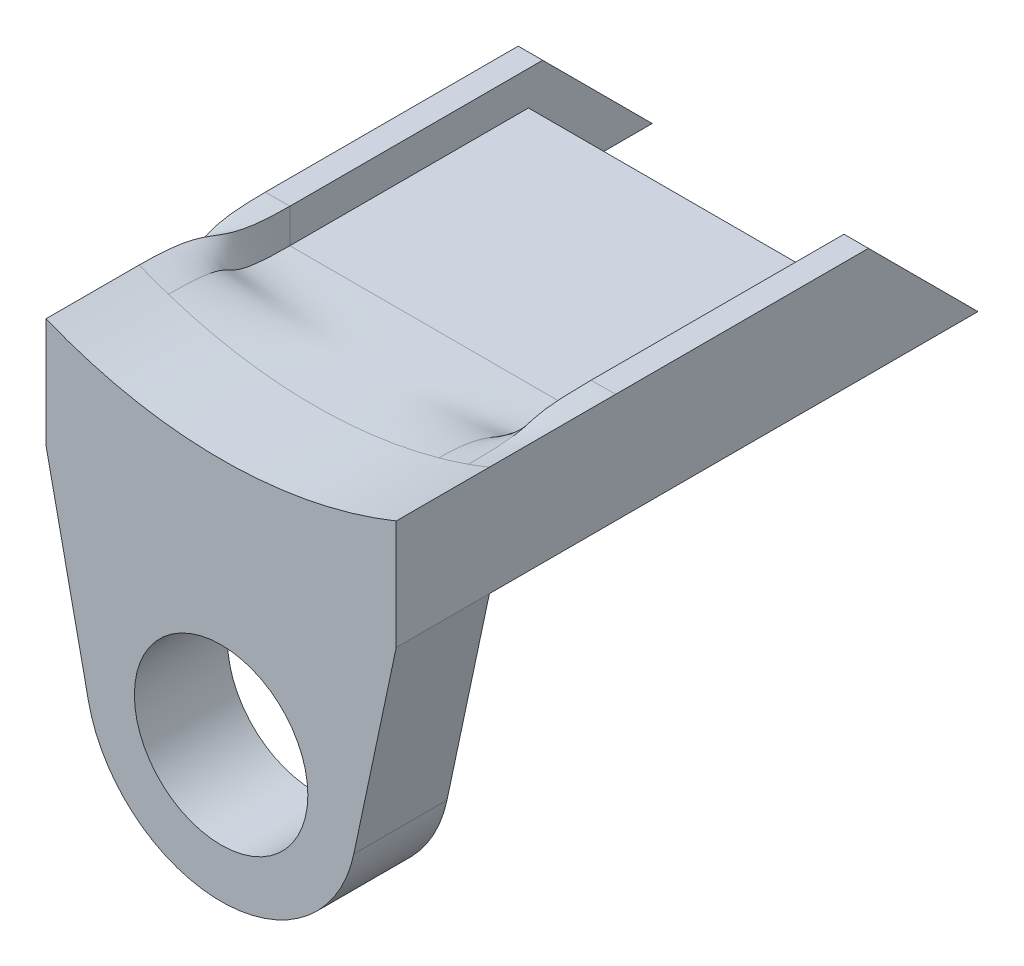
ISO-10303-21;
HEADER;
FILE_DESCRIPTION(('STEP AP214'),'2;1');
FILE_NAME('part.step','',(''),(''),'','','');
FILE_SCHEMA(('AUTOMOTIVE_DESIGN { 1 0 10303 214 1 1 1 1 }'));
ENDSEC;
DATA;
#1=APPLICATION_CONTEXT('core data for automotive mechanical design processes');
#2=APPLICATION_PROTOCOL_DEFINITION('international standard','automotive_design',2000,#1);
#3=PRODUCT_CONTEXT('',#1,'mechanical');
#4=PRODUCT('Part','Part','',(#3));
#5=PRODUCT_RELATED_PRODUCT_CATEGORY('part','',(#4));
#6=PRODUCT_DEFINITION_FORMATION('','',#4);
#7=PRODUCT_DEFINITION_CONTEXT('part definition',#1,'design');
#8=PRODUCT_DEFINITION('design','',#6,#7);
#9=PRODUCT_DEFINITION_SHAPE('','',#8);
#10=(LENGTH_UNIT() NAMED_UNIT(*) SI_UNIT(.MILLI.,.METRE.));
#11=(NAMED_UNIT(*) PLANE_ANGLE_UNIT() SI_UNIT($,.RADIAN.));
#12=(NAMED_UNIT(*) SI_UNIT($,.STERADIAN.) SOLID_ANGLE_UNIT());
#13=UNCERTAINTY_MEASURE_WITH_UNIT(LENGTH_MEASURE(1.E-05),#10,'distance_accuracy_value','');
#14=(GEOMETRIC_REPRESENTATION_CONTEXT(3) GLOBAL_UNCERTAINTY_ASSIGNED_CONTEXT((#13)) GLOBAL_UNIT_ASSIGNED_CONTEXT((#10,
#11,#12)) REPRESENTATION_CONTEXT('',''));
#15=CARTESIAN_POINT('',(0.,0.,0.));
#16=DIRECTION('',(0.,0.,1.));
#17=DIRECTION('',(1.,0.,0.));
#18=AXIS2_PLACEMENT_3D('',#15,#16,#17);
#19=CARTESIAN_POINT('',(7.7,0.,0.));
#20=DIRECTION('',(0.,1.,0.));
#21=DIRECTION('',(0.,0.,1.));
#22=AXIS2_PLACEMENT_3D('',#19,#20,#21);
#23=PLANE('',#22);
#24=DIRECTION('',(0.,0.,-1.));
#25=VECTOR('',#24,1.);
#26=CARTESIAN_POINT('',(-7.7,0.,0.));
#27=LINE('',#26,#25);
#28=CARTESIAN_POINT('',(-7.69999999999999,0.,14.2969383304317));
#29=VERTEX_POINT('',#28);
#30=CARTESIAN_POINT('',(-7.7,0.,0.));
#31=VERTEX_POINT('',#30);
#32=EDGE_CURVE('E365',#29,#31,#27,.T.);
#33=ORIENTED_EDGE('',*,*,#32,.T.);
#34=DIRECTION('',(-1.,0.,0.));
#35=VECTOR('',#34,1.);
#36=CARTESIAN_POINT('',(7.7,0.,0.));
#37=LINE('',#36,#35);
#38=CARTESIAN_POINT('',(7.7,0.,0.));
#39=VERTEX_POINT('',#38);
#40=EDGE_CURVE('E228',#39,#31,#37,.T.);
#41=ORIENTED_EDGE('',*,*,#40,.F.);
#42=DIRECTION('',(0.,0.,-1.));
#43=VECTOR('',#42,1.);
#44=CARTESIAN_POINT('',(7.7,0.,11.51471863));
#45=LINE('',#44,#43);
#46=CARTESIAN_POINT('',(7.69999999999999,0.,14.2969383304317));
#47=VERTEX_POINT('',#46);
#48=EDGE_CURVE('E360',#47,#39,#45,.T.);
#49=ORIENTED_EDGE('',*,*,#48,.F.);
#50=DIRECTION('',(1.,0.,0.));
#51=VECTOR('',#50,1.);
#52=CARTESIAN_POINT('',(7.7,0.,14.2969383304317));
#53=LINE('',#52,#51);
#54=EDGE_CURVE('E12',#47,#29,#53,.F.);
#55=ORIENTED_EDGE('',*,*,#54,.T.);
#56=EDGE_LOOP('',(#33,#41,#49,#55));
#57=FACE_BOUND('',#56,.T.);
#58=ADVANCED_FACE('F217',(#57),#23,.F.);
#59=CARTESIAN_POINT('',(7.7,2.1,2.09999987043166));
#60=DIRECTION('',(0.,-0.707106759372583,0.707106803000512));
#61=DIRECTION('',(0.,-0.707106803000512,-0.707106759372583));
#62=AXIS2_PLACEMENT_3D('',#59,#60,#61);
#63=PLANE('',#62);
#64=DIRECTION('',(0.,0.707106803000512,0.707106759372583));
#65=VECTOR('',#64,1.);
#66=CARTESIAN_POINT('',(-7.7,2.1,2.09999987043166));
#67=LINE('',#66,#65);
#68=CARTESIAN_POINT('',(-7.7,2.1,2.09999987043166));
#69=VERTEX_POINT('',#68);
#70=EDGE_CURVE('E368',#31,#69,#67,.T.);
#71=ORIENTED_EDGE('',*,*,#70,.T.);
#72=DIRECTION('',(-1.,0.,0.));
#73=VECTOR('',#72,1.);
#74=CARTESIAN_POINT('',(7.7,2.1,2.09999987043166));
#75=LINE('',#74,#73);
#76=CARTESIAN_POINT('',(7.7,2.1,2.09999987043166));
#77=VERTEX_POINT('',#76);
#78=EDGE_CURVE('E237',#77,#69,#75,.T.);
#79=ORIENTED_EDGE('',*,*,#78,.F.);
#80=DIRECTION('',(0.,0.707106803000512,0.707106759372583));
#81=VECTOR('',#80,1.);
#82=CARTESIAN_POINT('',(7.7,2.1,2.09999987043166));
#83=LINE('',#82,#81);
#84=EDGE_CURVE('E363',#39,#77,#83,.T.);
#85=ORIENTED_EDGE('',*,*,#84,.F.);
#86=ORIENTED_EDGE('',*,*,#40,.T.);
#87=EDGE_LOOP('',(#71,#79,#85,#86));
#88=FACE_BOUND('',#87,.T.);
#89=ADVANCED_FACE('F836',(#88),#63,.F.);
#90=CARTESIAN_POINT('',(7.7,2.1,14.2969383304317));
#91=DIRECTION('',(0.,-1.,0.));
#92=DIRECTION('',(0.,0.,-1.));
#93=AXIS2_PLACEMENT_3D('',#90,#91,#92);
#94=PLANE('',#93);
#95=DIRECTION('',(0.,0.,1.));
#96=VECTOR('',#95,1.);
#97=CARTESIAN_POINT('',(-7.7,2.1,14.2969383304317));
#98=LINE('',#97,#96);
#99=CARTESIAN_POINT('',(-7.7,2.09999999999999,14.2969383304317));
#100=VERTEX_POINT('',#99);
#101=EDGE_CURVE('E364',#69,#100,#98,.T.);
#102=ORIENTED_EDGE('',*,*,#101,.T.);
#103=DIRECTION('',(1.,0.,0.));
#104=VECTOR('',#103,1.);
#105=CARTESIAN_POINT('',(7.7,2.1,14.2969383304317));
#106=LINE('',#105,#104);
#107=CARTESIAN_POINT('',(7.7,2.1,14.2969383304317));
#108=VERTEX_POINT('',#107);
#109=EDGE_CURVE('E397',#108,#100,#106,.F.);
#110=ORIENTED_EDGE('',*,*,#109,.F.);
#111=DIRECTION('',(0.,0.,1.));
#112=VECTOR('',#111,1.);
#113=CARTESIAN_POINT('',(7.7,2.1,14.2969383304317));
#114=LINE('',#113,#112);
#115=EDGE_CURVE('E283',#77,#108,#114,.T.);
#116=ORIENTED_EDGE('',*,*,#115,.F.);
#117=ORIENTED_EDGE('',*,*,#78,.T.);
#118=EDGE_LOOP('',(#102,#110,#116,#117));
#119=FACE_BOUND('',#118,.T.);
#120=ADVANCED_FACE('F707',(#119),#94,.F.);
#121=CARTESIAN_POINT('',(8.95,-1.75,14.2969383304317));
#122=DIRECTION('',(0.,1.,0.));
#123=DIRECTION('',(0.,0.,1.));
#124=AXIS2_PLACEMENT_3D('',#121,#122,#123);
#125=PLANE('',#124);
#126=DIRECTION('',(0.,0.,-1.));
#127=VECTOR('',#126,1.);
#128=CARTESIAN_POINT('',(7.7,-1.75,14.2969383304317));
#129=LINE('',#128,#127);
#130=CARTESIAN_POINT('',(7.7,-1.75,14.2969383304317));
#131=VERTEX_POINT('',#130);
#132=CARTESIAN_POINT('',(7.7,-1.75,-4.22487354983044));
#133=VERTEX_POINT('',#132);
#134=EDGE_CURVE('E331',#131,#133,#129,.T.);
#135=ORIENTED_EDGE('',*,*,#134,.T.);
#136=DIRECTION('',(-1.,0.,0.));
#137=VECTOR('',#136,1.);
#138=CARTESIAN_POINT('',(8.95,-1.75,-4.22487354983044));
#139=LINE('',#138,#137);
#140=CARTESIAN_POINT('',(8.95,-1.75,-4.22487354983044));
#141=VERTEX_POINT('',#140);
#142=EDGE_CURVE('E327',#141,#133,#139,.T.);
#143=ORIENTED_EDGE('',*,*,#142,.F.);
#144=DIRECTION('',(0.,0.,-1.));
#145=VECTOR('',#144,1.);
#146=CARTESIAN_POINT('',(8.95,-1.75,14.2969383304317));
#147=LINE('',#146,#145);
#148=CARTESIAN_POINT('',(8.95,-1.75,20.7479588404317));
#149=VERTEX_POINT('',#148);
#150=EDGE_CURVE('E353',#149,#141,#147,.T.);
#151=ORIENTED_EDGE('',*,*,#150,.F.);
#152=DIRECTION('',(-1.,0.,0.));
#153=VECTOR('',#152,1.);
#154=CARTESIAN_POINT('',(8.95,-1.75,20.7479588404317));
#155=LINE('',#154,#153);
#156=CARTESIAN_POINT('',(7.90443925233645,-1.75,20.7479588404317));
#157=VERTEX_POINT('',#156);
#158=EDGE_CURVE('E373',#149,#157,#155,.T.);
#159=ORIENTED_EDGE('',*,*,#158,.T.);
#160=CARTESIAN_POINT('',(7.7,-1.75,14.2969383304317));
#161=CARTESIAN_POINT('',(7.7,-1.75,18.599777756172));
#162=CARTESIAN_POINT('',(7.90443925233645,-1.75,16.4451194146914));
#163=CARTESIAN_POINT('',(7.90443925233645,-1.75,20.7479588404317));
#164=B_SPLINE_CURVE_WITH_KNOTS('',3,(#160,#161,#162,#163),.UNSPECIFIED.,.F.,.F.,(4,4),(0.,1.),.UNSPECIFIED.);
#165=EDGE_CURVE('E405',#131,#157,#164,.T.);
#166=ORIENTED_EDGE('',*,*,#165,.F.);
#167=EDGE_LOOP('',(#135,#143,#151,#159,#166));
#168=FACE_BOUND('',#167,.T.);
#169=ADVANCED_FACE('F753',(#168),#125,.F.);
#170=CARTESIAN_POINT('',(8.95,-1.75,-4.22487354983044));
#171=DIRECTION('',(0.,-0.707106759372583,0.707106803000511));
#172=DIRECTION('',(0.,-0.707106803000511,-0.707106759372583));
#173=AXIS2_PLACEMENT_3D('',#170,#171,#172);
#174=PLANE('',#173);
#175=DIRECTION('',(0.,0.707106803000511,0.707106759372583));
#176=VECTOR('',#175,1.);
#177=CARTESIAN_POINT('',(7.7,-1.75,-4.22487354983044));
#178=LINE('',#177,#176);
#179=CARTESIAN_POINT('',(7.7,3.85,1.37512610465401));
#180=VERTEX_POINT('',#179);
#181=EDGE_CURVE('E321',#133,#180,#178,.T.);
#182=ORIENTED_EDGE('',*,*,#181,.T.);
#183=DIRECTION('',(-1.,0.,0.));
#184=VECTOR('',#183,1.);
#185=CARTESIAN_POINT('',(8.95,3.85,1.37512610465401));
#186=LINE('',#185,#184);
#187=CARTESIAN_POINT('',(8.95,3.85,1.37512610465401));
#188=VERTEX_POINT('',#187);
#189=EDGE_CURVE('E324',#188,#180,#186,.T.);
#190=ORIENTED_EDGE('',*,*,#189,.F.);
#191=DIRECTION('',(0.,0.707106803000511,0.707106759372583));
#192=VECTOR('',#191,1.);
#193=CARTESIAN_POINT('',(8.95,-1.75,-4.22487354983044));
#194=LINE('',#193,#192);
#195=EDGE_CURVE('E352',#141,#188,#194,.T.);
#196=ORIENTED_EDGE('',*,*,#195,.F.);
#197=ORIENTED_EDGE('',*,*,#142,.T.);
#198=EDGE_LOOP('',(#182,#190,#196,#197));
#199=FACE_BOUND('',#198,.T.);
#200=ADVANCED_FACE('F323',(#199),#174,.F.);
#201=CARTESIAN_POINT('',(8.95,3.85,1.37512610465401));
#202=DIRECTION('',(0.,-1.,0.));
#203=DIRECTION('',(0.,0.,-1.));
#204=AXIS2_PLACEMENT_3D('',#201,#202,#203);
#205=PLANE('',#204);
#206=DIRECTION('',(0.,0.,1.));
#207=VECTOR('',#206,1.);
#208=CARTESIAN_POINT('',(7.7,3.85,1.37512610465401));
#209=LINE('',#208,#207);
#210=CARTESIAN_POINT('',(7.7,3.85,14.2969383304317));
#211=VERTEX_POINT('',#210);
#212=EDGE_CURVE('E330',#180,#211,#209,.T.);
#213=ORIENTED_EDGE('',*,*,#212,.T.);
#214=DIRECTION('',(1.,0.,0.));
#215=VECTOR('',#214,1.);
#216=CARTESIAN_POINT('',(8.95,3.85,14.2969383304317));
#217=LINE('',#216,#215);
#218=CARTESIAN_POINT('',(8.95,3.85,14.2969383304317));
#219=VERTEX_POINT('',#218);
#220=EDGE_CURVE('E337',#219,#211,#217,.F.);
#221=ORIENTED_EDGE('',*,*,#220,.F.);
#222=DIRECTION('',(0.,0.,1.));
#223=VECTOR('',#222,1.);
#224=CARTESIAN_POINT('',(8.95,3.85,1.37512610465401));
#225=LINE('',#224,#223);
#226=EDGE_CURVE('E336',#188,#219,#225,.T.);
#227=ORIENTED_EDGE('',*,*,#226,.F.);
#228=ORIENTED_EDGE('',*,*,#189,.T.);
#229=EDGE_LOOP('',(#213,#221,#227,#228));
#230=FACE_BOUND('',#229,.T.);
#231=ADVANCED_FACE('F334',(#230),#205,.F.);
#232=CARTESIAN_POINT('',(8.95,0.,0.));
#233=DIRECTION('',(-1.,0.,0.));
#234=DIRECTION('',(0.,0.,1.));
#235=AXIS2_PLACEMENT_3D('',#232,#233,#234);
#236=PLANE('',#235);
#237=ORIENTED_EDGE('',*,*,#150,.T.);
#238=ORIENTED_EDGE('',*,*,#195,.T.);
#239=ORIENTED_EDGE('',*,*,#226,.T.);
#240=DIRECTION('',(0.,0.,-1.));
#241=VECTOR('',#240,1.);
#242=CARTESIAN_POINT('',(8.95,3.85,17.5224485854317));
#243=LINE('',#242,#241);
#244=CARTESIAN_POINT('',(8.95,3.85,20.7479588404317));
#245=VERTEX_POINT('',#244);
#246=EDGE_CURVE('E667',#245,#219,#243,.T.);
#247=ORIENTED_EDGE('',*,*,#246,.F.);
#248=DIRECTION('',(0.,0.,-1.));
#249=VECTOR('',#248,1.);
#250=CARTESIAN_POINT('',(8.95,3.85,25.5104588404317));
#251=LINE('',#250,#249);
#252=CARTESIAN_POINT('',(8.95,3.85,25.5104588404317));
#253=VERTEX_POINT('',#252);
#254=EDGE_CURVE('E626',#253,#245,#251,.T.);
#255=ORIENTED_EDGE('',*,*,#254,.F.);
#256=DIRECTION('',(0.,1.,0.));
#257=VECTOR('',#256,1.);
#258=CARTESIAN_POINT('',(8.95,3.85,25.5104588404317));
#259=LINE('',#258,#257);
#260=CARTESIAN_POINT('',(8.95,-1.75,25.5104588404317));
#261=VERTEX_POINT('',#260);
#262=EDGE_CURVE('E764',#261,#253,#259,.T.);
#263=ORIENTED_EDGE('',*,*,#262,.F.);
#264=DIRECTION('',(0.,0.,-1.));
#265=VECTOR('',#264,1.);
#266=CARTESIAN_POINT('',(8.95,-1.75,25.5104588404317));
#267=LINE('',#266,#265);
#268=EDGE_CURVE('E649',#261,#149,#267,.T.);
#269=ORIENTED_EDGE('',*,*,#268,.T.);
#270=EDGE_LOOP('',(#237,#238,#239,#247,#255,#263,#269));
#271=FACE_BOUND('',#270,.T.);
#272=ADVANCED_FACE('F758',(#271),#236,.F.);
#273=CARTESIAN_POINT('',(7.7,0.,0.));
#274=DIRECTION('',(-1.,0.,0.));
#275=DIRECTION('',(0.,0.,1.));
#276=AXIS2_PLACEMENT_3D('',#273,#274,#275);
#277=PLANE('',#276);
#278=DIRECTION('',(0.,1.,0.));
#279=VECTOR('',#278,1.);
#280=CARTESIAN_POINT('',(7.7,0.,14.2969383304317));
#281=LINE('',#280,#279);
#282=EDGE_CURVE('E344',#47,#131,#281,.F.);
#283=ORIENTED_EDGE('',*,*,#282,.F.);
#284=ORIENTED_EDGE('',*,*,#48,.T.);
#285=ORIENTED_EDGE('',*,*,#84,.T.);
#286=ORIENTED_EDGE('',*,*,#115,.T.);
#287=DIRECTION('',(0.,1.,0.));
#288=VECTOR('',#287,1.);
#289=CARTESIAN_POINT('',(7.7,0.,14.2969383304317));
#290=LINE('',#289,#288);
#291=EDGE_CURVE('E342',#211,#108,#290,.F.);
#292=ORIENTED_EDGE('',*,*,#291,.F.);
#293=ORIENTED_EDGE('',*,*,#212,.F.);
#294=ORIENTED_EDGE('',*,*,#181,.F.);
#295=ORIENTED_EDGE('',*,*,#134,.F.);
#296=EDGE_LOOP('',(#283,#284,#285,#286,#292,#293,#294,#295));
#297=FACE_BOUND('',#296,.T.);
#298=ADVANCED_FACE('F340',(#297),#277,.T.);
#299=CARTESIAN_POINT('',(-7.7,0.,0.));
#300=DIRECTION('',(1.,0.,0.));
#301=DIRECTION('',(0.,0.,1.));
#302=AXIS2_PLACEMENT_3D('',#299,#300,#301);
#303=PLANE('',#302);
#304=ORIENTED_EDGE('',*,*,#101,.F.);
#305=ORIENTED_EDGE('',*,*,#70,.F.);
#306=ORIENTED_EDGE('',*,*,#32,.F.);
#307=DIRECTION('',(0.,-1.,0.));
#308=VECTOR('',#307,1.);
#309=CARTESIAN_POINT('',(-7.7,0.,14.2969383304317));
#310=LINE('',#309,#308);
#311=CARTESIAN_POINT('',(-7.7,-1.75,14.2969383304317));
#312=VERTEX_POINT('',#311);
#313=EDGE_CURVE('E372',#29,#312,#310,.T.);
#314=ORIENTED_EDGE('',*,*,#313,.T.);
#315=DIRECTION('',(0.,0.,-1.));
#316=VECTOR('',#315,1.);
#317=CARTESIAN_POINT('',(-7.7,-1.75,14.2969383304317));
#318=LINE('',#317,#316);
#319=CARTESIAN_POINT('',(-7.7,-1.75,-4.22487354983044));
#320=VERTEX_POINT('',#319);
#321=EDGE_CURVE('E369',#312,#320,#318,.T.);
#322=ORIENTED_EDGE('',*,*,#321,.T.);
#323=DIRECTION('',(0.,0.707106803000511,0.707106759372583));
#324=VECTOR('',#323,1.);
#325=CARTESIAN_POINT('',(-7.7,-1.75,-4.22487354983044));
#326=LINE('',#325,#324);
#327=CARTESIAN_POINT('',(-7.7,3.85,1.37512610465401));
#328=VERTEX_POINT('',#327);
#329=EDGE_CURVE('E378',#320,#328,#326,.T.);
#330=ORIENTED_EDGE('',*,*,#329,.T.);
#331=DIRECTION('',(0.,0.,1.));
#332=VECTOR('',#331,1.);
#333=CARTESIAN_POINT('',(-7.7,3.85,1.37512610465401));
#334=LINE('',#333,#332);
#335=CARTESIAN_POINT('',(-7.7,3.85,14.2969383304317));
#336=VERTEX_POINT('',#335);
#337=EDGE_CURVE('E383',#328,#336,#334,.T.);
#338=ORIENTED_EDGE('',*,*,#337,.T.);
#339=DIRECTION('',(0.,-1.,0.));
#340=VECTOR('',#339,1.);
#341=CARTESIAN_POINT('',(-7.7,0.,14.2969383304317));
#342=LINE('',#341,#340);
#343=EDGE_CURVE('E386',#336,#100,#342,.T.);
#344=ORIENTED_EDGE('',*,*,#343,.T.);
#345=EDGE_LOOP('',(#304,#305,#306,#314,#322,#330,#338,#344));
#346=FACE_BOUND('',#345,.T.);
#347=ADVANCED_FACE('F703',(#346),#303,.T.);
#348=CARTESIAN_POINT('',(-8.95,-1.75,14.2969383304317));
#349=DIRECTION('',(0.,-1.,0.));
#350=DIRECTION('',(0.,0.,-1.));
#351=AXIS2_PLACEMENT_3D('',#348,#349,#350);
#352=PLANE('',#351);
#353=ORIENTED_EDGE('',*,*,#321,.F.);
#354=CARTESIAN_POINT('',(-7.7,-1.75,14.2969383304317));
#355=CARTESIAN_POINT('',(-7.7,-1.75,18.599777756172));
#356=CARTESIAN_POINT('',(-7.90443925233643,-1.75,16.4451194146914));
#357=CARTESIAN_POINT('',(-7.90443925233643,-1.75,20.7479588404317));
#358=B_SPLINE_CURVE_WITH_KNOTS('',3,(#354,#355,#356,#357),.UNSPECIFIED.,.F.,.F.,(4,4),(0.,1.),.UNSPECIFIED.);
#359=CARTESIAN_POINT('',(-7.90443925233641,-1.75,20.7479588404317));
#360=VERTEX_POINT('',#359);
#361=EDGE_CURVE('E465',#312,#360,#358,.T.);
#362=ORIENTED_EDGE('',*,*,#361,.T.);
#363=CARTESIAN_POINT('',(-8.95,-1.75,20.7479588404317));
#364=VERTEX_POINT('',#363);
#365=EDGE_CURVE('E294',#360,#364,#155,.T.);
#366=ORIENTED_EDGE('',*,*,#365,.T.);
#367=DIRECTION('',(0.,0.,-1.));
#368=VECTOR('',#367,1.);
#369=CARTESIAN_POINT('',(-8.95,-1.75,14.2969383304317));
#370=LINE('',#369,#368);
#371=CARTESIAN_POINT('',(-8.95,-1.75,-4.22487354983044));
#372=VERTEX_POINT('',#371);
#373=EDGE_CURVE('E374',#364,#372,#370,.T.);
#374=ORIENTED_EDGE('',*,*,#373,.T.);
#375=DIRECTION('',(1.,0.,0.));
#376=VECTOR('',#375,1.);
#377=CARTESIAN_POINT('',(-8.95,-1.75,-4.22487354983044));
#378=LINE('',#377,#376);
#379=EDGE_CURVE('E716',#372,#320,#378,.T.);
#380=ORIENTED_EDGE('',*,*,#379,.T.);
#381=EDGE_LOOP('',(#353,#362,#366,#374,#380));
#382=FACE_BOUND('',#381,.T.);
#383=ADVANCED_FACE('F732',(#382),#352,.T.);
#384=CARTESIAN_POINT('',(-8.95,3.85,1.37512610465401));
#385=DIRECTION('',(0.,1.,0.));
#386=DIRECTION('',(0.,0.,1.));
#387=AXIS2_PLACEMENT_3D('',#384,#385,#386);
#388=PLANE('',#387);
#389=ORIENTED_EDGE('',*,*,#337,.F.);
#390=DIRECTION('',(1.,0.,0.));
#391=VECTOR('',#390,1.);
#392=CARTESIAN_POINT('',(-8.95,3.85,1.37512610465401));
#393=LINE('',#392,#391);
#394=CARTESIAN_POINT('',(-8.95,3.85,1.37512610465401));
#395=VERTEX_POINT('',#394);
#396=EDGE_CURVE('E394',#395,#328,#393,.T.);
#397=ORIENTED_EDGE('',*,*,#396,.F.);
#398=DIRECTION('',(0.,0.,1.));
#399=VECTOR('',#398,1.);
#400=CARTESIAN_POINT('',(-8.95,3.85,1.37512610465401));
#401=LINE('',#400,#399);
#402=CARTESIAN_POINT('',(-8.95,3.85,14.2969383304317));
#403=VERTEX_POINT('',#402);
#404=EDGE_CURVE('E377',#395,#403,#401,.T.);
#405=ORIENTED_EDGE('',*,*,#404,.T.);
#406=DIRECTION('',(1.,0.,0.));
#407=VECTOR('',#406,1.);
#408=CARTESIAN_POINT('',(-8.95,3.85,14.2969383304317));
#409=LINE('',#408,#407);
#410=EDGE_CURVE('E359',#403,#336,#409,.T.);
#411=ORIENTED_EDGE('',*,*,#410,.T.);
#412=EDGE_LOOP('',(#389,#397,#405,#411));
#413=FACE_BOUND('',#412,.T.);
#414=ADVANCED_FACE('F724',(#413),#388,.T.);
#415=CARTESIAN_POINT('',(-8.95,-1.75,-4.22487354983044));
#416=DIRECTION('',(0.,0.707106759372583,-0.707106803000511));
#417=DIRECTION('',(0.,0.707106803000511,0.707106759372583));
#418=AXIS2_PLACEMENT_3D('',#415,#416,#417);
#419=PLANE('',#418);
#420=ORIENTED_EDGE('',*,*,#329,.F.);
#421=ORIENTED_EDGE('',*,*,#379,.F.);
#422=DIRECTION('',(0.,0.707106803000511,0.707106759372583));
#423=VECTOR('',#422,1.);
#424=CARTESIAN_POINT('',(-8.95,-1.75,-4.22487354983044));
#425=LINE('',#424,#423);
#426=EDGE_CURVE('E382',#372,#395,#425,.T.);
#427=ORIENTED_EDGE('',*,*,#426,.T.);
#428=ORIENTED_EDGE('',*,*,#396,.T.);
#429=EDGE_LOOP('',(#420,#421,#427,#428));
#430=FACE_BOUND('',#429,.T.);
#431=ADVANCED_FACE('F720',(#430),#419,.T.);
#432=CARTESIAN_POINT('',(-8.95,0.,0.));
#433=DIRECTION('',(1.,0.,0.));
#434=DIRECTION('',(0.,0.,1.));
#435=AXIS2_PLACEMENT_3D('',#432,#433,#434);
#436=PLANE('',#435);
#437=ORIENTED_EDGE('',*,*,#373,.F.);
#438=DIRECTION('',(0.,0.,-1.));
#439=VECTOR('',#438,1.);
#440=CARTESIAN_POINT('',(-8.95,-1.75,25.5104588404317));
#441=LINE('',#440,#439);
#442=CARTESIAN_POINT('',(-8.95,-1.75,25.5104588404317));
#443=VERTEX_POINT('',#442);
#444=EDGE_CURVE('E655',#443,#364,#441,.T.);
#445=ORIENTED_EDGE('',*,*,#444,.F.);
#446=DIRECTION('',(0.,-1.,0.));
#447=VECTOR('',#446,1.);
#448=CARTESIAN_POINT('',(-8.95,3.85,25.5104588404317));
#449=LINE('',#448,#447);
#450=CARTESIAN_POINT('',(-8.95,3.85,25.5104588404317));
#451=VERTEX_POINT('',#450);
#452=EDGE_CURVE('E793',#451,#443,#449,.T.);
#453=ORIENTED_EDGE('',*,*,#452,.F.);
#454=DIRECTION('',(0.,0.,-1.));
#455=VECTOR('',#454,1.);
#456=CARTESIAN_POINT('',(-8.95,3.85,25.5104588404317));
#457=LINE('',#456,#455);
#458=CARTESIAN_POINT('',(-8.95,3.85,20.7479588404317));
#459=VERTEX_POINT('',#458);
#460=EDGE_CURVE('E456',#451,#459,#457,.T.);
#461=ORIENTED_EDGE('',*,*,#460,.T.);
#462=DIRECTION('',(0.,1.,0.));
#463=VECTOR('',#462,1.);
#464=CARTESIAN_POINT('',(-8.95,-1.75,20.7479588404317));
#465=LINE('',#464,#463);
#466=CARTESIAN_POINT('',(-8.95,2.82810218978102,20.7479588404317));
#467=VERTEX_POINT('',#466);
#468=EDGE_CURVE('E422',#467,#459,#465,.T.);
#469=ORIENTED_EDGE('',*,*,#468,.F.);
#470=CARTESIAN_POINT('',(-8.95,3.85,14.2969383304317));
#471=CARTESIAN_POINT('',(-8.95,3.85,18.6512435182746));
#472=CARTESIAN_POINT('',(-8.95,2.82810218978102,16.3936536525887));
#473=CARTESIAN_POINT('',(-8.95,2.82810218978102,20.7479588404317));
#474=B_SPLINE_CURVE_WITH_KNOTS('',3,(#470,#471,#472,#473),.UNSPECIFIED.,.F.,.F.,(4,4),(0.,1.),.UNSPECIFIED.);
#475=EDGE_CURVE('E452',#403,#467,#474,.T.);
#476=ORIENTED_EDGE('',*,*,#475,.F.);
#477=ORIENTED_EDGE('',*,*,#404,.F.);
#478=ORIENTED_EDGE('',*,*,#426,.F.);
#479=EDGE_LOOP('',(#437,#445,#453,#461,#469,#476,#477,#478));
#480=FACE_BOUND('',#479,.T.);
#481=ADVANCED_FACE('F450',(#480),#436,.F.);
#482=CARTESIAN_POINT('',(8.95,3.85,14.2969383304317));
#483=CARTESIAN_POINT('',(8.95,3.85,18.5976186704317));
#484=CARTESIAN_POINT('',(8.95,3.85,16.4472785004317));
#485=CARTESIAN_POINT('',(8.95,3.85,20.7479588404317));
#486=CARTESIAN_POINT('',(8.53333333333333,3.85,14.2969383304317));
#487=CARTESIAN_POINT('',(8.53333333333333,3.85,18.6010100957727));
#488=CARTESIAN_POINT('',(8.59691267707466,3.70643223792009,16.4438870750906));
#489=CARTESIAN_POINT('',(8.59691267707466,3.70643223792009,20.7479588404317));
#490=CARTESIAN_POINT('',(8.11666666666667,3.85,14.2969383304317));
#491=CARTESIAN_POINT('',(8.11666666666667,3.85,18.6044015211138));
#492=CARTESIAN_POINT('',(8.24502872040204,3.57308472279848,16.4404956497495));
#493=CARTESIAN_POINT('',(8.24502872040204,3.57308472279848,20.7479588404317));
#494=CARTESIAN_POINT('',(7.7,3.85,14.2969383304317));
#495=CARTESIAN_POINT('',(7.7,3.85,18.6077929464549));
#496=CARTESIAN_POINT('',(7.88547031204234,3.4465931780334,16.4371042244085));
#497=CARTESIAN_POINT('',(7.88547031204234,3.4465931780334,20.7479588404317));
#498=B_SPLINE_SURFACE_WITH_KNOTS('',3,3,((#482,#483,#484,#485),(#486,#487,#488,#489),(#490,#491,
#492,#493),(#494,#495,#496,#497)),.UNSPECIFIED.,.F.,.F.,.F.,(4,4),(4,4),(0.,1.),(0.,1.),.UNSPECIFIED.);
#499=CARTESIAN_POINT('',(7.7,3.85,14.2969383304317));
#500=CARTESIAN_POINT('',(7.7,3.85,18.6077929464549));
#501=CARTESIAN_POINT('',(7.88547031204234,3.4465931780334,16.4371042244085));
#502=CARTESIAN_POINT('',(7.88547031204234,3.4465931780334,20.7479588404317));
#503=B_SPLINE_CURVE_WITH_KNOTS('',3,(#499,#500,#501,#502),.UNSPECIFIED.,.F.,.F.,(4,4),(0.,1.),.UNSPECIFIED.);
#504=CARTESIAN_POINT('',(7.88547408525336,3.4465824529284,20.7479588404317));
#505=VERTEX_POINT('',#504);
#506=EDGE_CURVE('E670',#211,#505,#503,.T.);
#507=CARTESIAN_POINT('',(0.,25.8614285714286,20.7479588404317));
#508=DIRECTION('',(0.,0.,1.));
#509=DIRECTION('',(-1.,0.,0.));
#510=AXIS2_PLACEMENT_3D('',#507,#508,#509);
#511=CIRCLE('',#510,23.7614285714286);
#512=EDGE_CURVE('E400',#505,#245,#511,.T.);
#513=ORIENTED_EDGE('',*,*,#220,.T.);
#514=ORIENTED_EDGE('',*,*,#506,.T.);
#515=ORIENTED_EDGE('',*,*,#512,.T.);
#516=ORIENTED_EDGE('',*,*,#246,.T.);
#517=EDGE_LOOP('',(#513,#514,#515,#516));
#518=FACE_BOUND('',#517,.T.);
#519=ADVANCED_FACE('F594',(#518),#498,.T.);
#520=CARTESIAN_POINT('',(7.7,3.85,14.2969383304317));
#521=CARTESIAN_POINT('',(7.7,3.85,18.6077929464549));
#522=CARTESIAN_POINT('',(7.88547031204234,3.4465931780334,16.4371042244085));
#523=CARTESIAN_POINT('',(7.88547031204234,3.4465931780334,20.7479588404317));
#524=CARTESIAN_POINT('',(7.7,3.26666666666667,14.2969383304317));
#525=CARTESIAN_POINT('',(7.7,3.26666666666667,18.6474298611932));
#526=CARTESIAN_POINT('',(7.38308097717684,3.26985415159665,16.3974673096701));
#527=CARTESIAN_POINT('',(7.38308097717683,3.26985415159665,20.7479588404317));
#528=CARTESIAN_POINT('',(7.7,2.68333333333333,14.2969383304317));
#529=CARTESIAN_POINT('',(7.7,2.68333333333333,18.6870667759316));
#530=CARTESIAN_POINT('',(6.87838263690713,3.11111051249478,16.3578303949317));
#531=CARTESIAN_POINT('',(6.87838263690713,3.11111051249478,20.7479588404317));
#532=CARTESIAN_POINT('',(7.7,2.1,14.2969383304317));
#533=CARTESIAN_POINT('',(7.7,2.1,18.72670369067));
#534=CARTESIAN_POINT('',(6.3652764238384,2.9684439734512,16.3181934801934));
#535=CARTESIAN_POINT('',(6.3652764238384,2.9684439734512,20.7479588404317));
#536=B_SPLINE_SURFACE_WITH_KNOTS('',3,3,((#520,#521,#522,#523),(#524,#525,#526,#527),(#528,#529,
#530,#531),(#532,#533,#534,#535)),.UNSPECIFIED.,.F.,.F.,.F.,(4,4),(4,4),(0.,1.),(0.,1.),.UNSPECIFIED.);
#537=CARTESIAN_POINT('',(7.7,2.1,14.2969383304317));
#538=CARTESIAN_POINT('',(7.7,2.1,18.72670369067));
#539=CARTESIAN_POINT('',(6.3652764238384,2.9684439734512,16.3181934801934));
#540=CARTESIAN_POINT('',(6.3652764238384,2.9684439734512,20.7479588404317));
#541=B_SPLINE_CURVE_WITH_KNOTS('',3,(#537,#538,#539,#540),.UNSPECIFIED.,.F.,.F.,(4,4),(0.,1.),.UNSPECIFIED.);
#542=CARTESIAN_POINT('',(6.36527656916461,2.96844345085964,20.7479588404317));
#543=VERTEX_POINT('',#542);
#544=EDGE_CURVE('E674',#108,#543,#541,.T.);
#545=EDGE_CURVE('E404',#543,#505,#511,.T.);
#546=ORIENTED_EDGE('',*,*,#291,.T.);
#547=ORIENTED_EDGE('',*,*,#544,.T.);
#548=ORIENTED_EDGE('',*,*,#545,.T.);
#549=ORIENTED_EDGE('',*,*,#506,.F.);
#550=EDGE_LOOP('',(#546,#547,#548,#549));
#551=FACE_BOUND('',#550,.T.);
#552=ADVANCED_FACE('F584',(#551),#536,.T.);
#553=CARTESIAN_POINT('',(7.7,2.1,14.2969383304317));
#554=CARTESIAN_POINT('',(7.7,2.1,18.72670369067));
#555=CARTESIAN_POINT('',(6.3652764238384,2.96844397345121,16.3181934801934));
#556=CARTESIAN_POINT('',(6.3652764238384,2.96844397345121,20.7479588404317));
#557=CARTESIAN_POINT('',(2.56666666666667,2.1,14.2969383304317));
#558=CARTESIAN_POINT('',(2.56666666666667,2.1,18.7092706121728));
#559=CARTESIAN_POINT('',(1.82782544736559,1.70682910618673,16.3356265586905));
#560=CARTESIAN_POINT('',(1.82782544736559,1.70682910618673,20.7479588404317));
#561=CARTESIAN_POINT('',(-2.56666666666666,2.1,14.2969383304317));
#562=CARTESIAN_POINT('',(-2.56666666666666,2.1,18.6918375336757));
#563=CARTESIAN_POINT('',(-2.98263494164103,1.82209601003659,16.3530596371877));
#564=CARTESIAN_POINT('',(-2.98263494164103,1.82209601003659,20.7479588404317));
#565=CARTESIAN_POINT('',(-7.7,2.1,14.2969383304317));
#566=CARTESIAN_POINT('',(-7.7,2.1,18.6744044551785));
#567=CARTESIAN_POINT('',(-7.4544521966588,3.29958843807884,16.3704927156848));
#568=CARTESIAN_POINT('',(-7.4544521966588,3.29958843807884,20.7479588404317));
#569=B_SPLINE_SURFACE_WITH_KNOTS('',3,3,((#553,#554,#555,#556),(#557,#558,#559,#560),(#561,#562,
#563,#564),(#565,#566,#567,#568)),.UNSPECIFIED.,.F.,.F.,.F.,(4,4),(4,4),(0.,1.),(0.,1.),.UNSPECIFIED.);
#570=CARTESIAN_POINT('',(-7.7,2.1,14.2969383304317));
#571=CARTESIAN_POINT('',(-7.7,2.1,18.6744044551785));
#572=CARTESIAN_POINT('',(-7.4544521966588,3.29958843807884,16.3704927156848));
#573=CARTESIAN_POINT('',(-7.4544521966588,3.29958843807884,20.7479588404317));
#574=B_SPLINE_CURVE_WITH_KNOTS('',3,(#570,#571,#572,#573),.UNSPECIFIED.,.F.,.F.,(4,4),(0.,1.),.UNSPECIFIED.);
#575=CARTESIAN_POINT('',(-7.45445278838087,3.29958664695005,20.7479588404317));
#576=VERTEX_POINT('',#575);
#577=EDGE_CURVE('E471',#100,#576,#574,.T.);
#578=EDGE_CURVE('E417',#576,#543,#511,.T.);
#579=ORIENTED_EDGE('',*,*,#109,.T.);
#580=ORIENTED_EDGE('',*,*,#577,.T.);
#581=ORIENTED_EDGE('',*,*,#578,.T.);
#582=ORIENTED_EDGE('',*,*,#544,.F.);
#583=EDGE_LOOP('',(#579,#580,#581,#582));
#584=FACE_BOUND('',#583,.T.);
#585=ADVANCED_FACE('F542',(#584),#569,.T.);
#586=CARTESIAN_POINT('',(-7.7,2.1,14.2969383304317));
#587=CARTESIAN_POINT('',(-7.7,2.1,18.6744044551785));
#588=CARTESIAN_POINT('',(-7.4544521966588,3.29958843807884,16.3704927156848));
#589=CARTESIAN_POINT('',(-7.4544521966588,3.29958843807884,20.7479588404317));
#590=CARTESIAN_POINT('',(-7.7,2.68333333333333,14.2969383304317));
#591=CARTESIAN_POINT('',(-7.7,2.68333333333333,18.6754734097299));
#592=CARTESIAN_POINT('',(-7.96013638567922,3.46666694725092,16.3694237611334));
#593=CARTESIAN_POINT('',(-7.96013638567922,3.46666694725092,20.7479588404317));
#594=CARTESIAN_POINT('',(-7.7,3.26666666666666,14.2969383304317));
#595=CARTESIAN_POINT('',(-7.7,3.26666666666666,18.6765423642813));
#596=CARTESIAN_POINT('',(-8.45665232354559,3.64940140232432,16.368354806582));
#597=CARTESIAN_POINT('',(-8.45665232354559,3.64940140232432,20.7479588404317));
#598=CARTESIAN_POINT('',(-7.7,3.85,14.2969383304317));
#599=CARTESIAN_POINT('',(-7.7,3.85,18.6776113188328));
#600=CARTESIAN_POINT('',(-8.94999999999999,3.85,16.3672858520306));
#601=CARTESIAN_POINT('',(-8.94999999999999,3.85,20.7479588404317));
#602=B_SPLINE_SURFACE_WITH_KNOTS('',3,3,((#586,#587,#588,#589),(#590,#591,#592,#593),(#594,#595,
#596,#597),(#598,#599,#600,#601)),.UNSPECIFIED.,.F.,.F.,.F.,(4,4),(4,4),(0.,1.),(0.,1.),.UNSPECIFIED.);
#603=CARTESIAN_POINT('',(-7.7,3.85,14.2969383304317));
#604=CARTESIAN_POINT('',(-7.7,3.85,18.6776113188328));
#605=CARTESIAN_POINT('',(-8.94999999999999,3.85,16.3672858520306));
#606=CARTESIAN_POINT('',(-8.94999999999999,3.85,20.7479588404317));
#607=B_SPLINE_CURVE_WITH_KNOTS('',3,(#603,#604,#605,#606),.UNSPECIFIED.,.F.,.F.,(4,4),(0.,1.),.UNSPECIFIED.);
#608=EDGE_CURVE('E466',#336,#459,#607,.T.);
#609=EDGE_CURVE('E419',#459,#576,#511,.T.);
#610=ORIENTED_EDGE('',*,*,#343,.F.);
#611=ORIENTED_EDGE('',*,*,#608,.T.);
#612=ORIENTED_EDGE('',*,*,#609,.T.);
#613=ORIENTED_EDGE('',*,*,#577,.F.);
#614=EDGE_LOOP('',(#610,#611,#612,#613));
#615=FACE_BOUND('',#614,.T.);
#616=ADVANCED_FACE('F530',(#615),#602,.T.);
#617=CARTESIAN_POINT('',(-7.7,3.85,14.2969383304317));
#618=CARTESIAN_POINT('',(-7.7,3.85,18.6776113188328));
#619=CARTESIAN_POINT('',(-8.94999999999999,3.85,16.3672858520306));
#620=CARTESIAN_POINT('',(-8.94999999999999,3.85,20.7479588404317));
#621=CARTESIAN_POINT('',(-8.11666666666667,3.85,14.2969383304317));
#622=CARTESIAN_POINT('',(-8.11666666666667,3.85,18.66882205198));
#623=CARTESIAN_POINT('',(-8.94999999999999,3.50936739659367,16.3760751188833));
#624=CARTESIAN_POINT('',(-8.94999999999999,3.50936739659367,20.7479588404317));
#625=CARTESIAN_POINT('',(-8.53333333333333,3.85,14.2969383304317));
#626=CARTESIAN_POINT('',(-8.53333333333333,3.85,18.6600327851273));
#627=CARTESIAN_POINT('',(-8.95,3.16873479318735,16.384864385736));
#628=CARTESIAN_POINT('',(-8.95,3.16873479318735,20.7479588404317));
#629=CARTESIAN_POINT('',(-8.95,3.85,14.2969383304317));
#630=CARTESIAN_POINT('',(-8.95,3.85,18.6512435182746));
#631=CARTESIAN_POINT('',(-8.95,2.82810218978102,16.3936536525887));
#632=CARTESIAN_POINT('',(-8.95,2.82810218978102,20.7479588404317));
#633=B_SPLINE_SURFACE_WITH_KNOTS('',3,3,((#617,#618,#619,#620),(#621,#622,#623,#624),(#625,#626,
#627,#628),(#629,#630,#631,#632)),.UNSPECIFIED.,.F.,.F.,.F.,(4,4),(4,4),(0.,1.),(0.,1.),.UNSPECIFIED.);
#634=ORIENTED_EDGE('',*,*,#410,.F.);
#635=ORIENTED_EDGE('',*,*,#475,.T.);
#636=ORIENTED_EDGE('',*,*,#468,.T.);
#637=ORIENTED_EDGE('',*,*,#608,.F.);
#638=EDGE_LOOP('',(#634,#635,#636,#637));
#639=FACE_BOUND('',#638,.T.);
#640=ADVANCED_FACE('F464',(#639),#633,.T.);
#641=CARTESIAN_POINT('',(-7.7,-1.75,14.2969383304317));
#642=CARTESIAN_POINT('',(-7.7,-1.75,18.599777756172));
#643=CARTESIAN_POINT('',(-7.90443925233643,-1.75,16.4451194146914));
#644=CARTESIAN_POINT('',(-7.90443925233643,-1.75,20.7479588404317));
#645=CARTESIAN_POINT('',(-7.7,-1.16666666666667,14.2969383304317));
#646=CARTESIAN_POINT('',(-7.7,-1.16666666666667,18.6770030833169));
#647=CARTESIAN_POINT('',(-7.41651090342678,-1.75,16.3678940875464));
#648=CARTESIAN_POINT('',(-7.41651090342678,-1.75,20.7479588404317));
#649=CARTESIAN_POINT('',(-7.7,-0.583333333333334,14.2969383304317));
#650=CARTESIAN_POINT('',(-7.7,-0.583333333333334,18.7542284104619));
#651=CARTESIAN_POINT('',(-6.92858255451712,-1.75,16.2906687604015));
#652=CARTESIAN_POINT('',(-6.92858255451712,-1.75,20.7479588404317));
#653=CARTESIAN_POINT('',(-7.7,0.,14.2969383304317));
#654=CARTESIAN_POINT('',(-7.7,0.,18.8314537376068));
#655=CARTESIAN_POINT('',(-6.44065420560746,-1.75,16.2134434332565));
#656=CARTESIAN_POINT('',(-6.44065420560746,-1.75,20.7479588404317));
#657=B_SPLINE_SURFACE_WITH_KNOTS('',3,3,((#641,#642,#643,#644),(#645,#646,#647,#648),(#649,#650,
#651,#652),(#653,#654,#655,#656)),.UNSPECIFIED.,.F.,.F.,.F.,(4,4),(4,4),(0.,1.),(0.,1.),.UNSPECIFIED.);
#658=CARTESIAN_POINT('',(-7.7,0.,14.2969383304317));
#659=CARTESIAN_POINT('',(-7.7,0.,18.8314537376068));
#660=CARTESIAN_POINT('',(-6.44065420560746,-1.75,16.2134434332565));
#661=CARTESIAN_POINT('',(-6.44065420560746,-1.75,20.7479588404317));
#662=B_SPLINE_CURVE_WITH_KNOTS('',3,(#658,#659,#660,#661),.UNSPECIFIED.,.F.,.F.,(4,4),(0.,1.),.UNSPECIFIED.);
#663=CARTESIAN_POINT('',(-6.44065420560745,-1.75,20.7479588404317));
#664=VERTEX_POINT('',#663);
#665=EDGE_CURVE('E469',#29,#664,#662,.T.);
#666=EDGE_CURVE('E442',#664,#360,#155,.T.);
#667=ORIENTED_EDGE('',*,*,#313,.F.);
#668=ORIENTED_EDGE('',*,*,#665,.T.);
#669=ORIENTED_EDGE('',*,*,#666,.T.);
#670=ORIENTED_EDGE('',*,*,#361,.F.);
#671=EDGE_LOOP('',(#667,#668,#669,#670));
#672=FACE_BOUND('',#671,.T.);
#673=ADVANCED_FACE('F557',(#672),#657,.T.);
#674=CARTESIAN_POINT('',(-7.7,0.,14.2969383304317));
#675=CARTESIAN_POINT('',(-7.7,0.,18.8314537376068));
#676=CARTESIAN_POINT('',(-6.44065420560746,-1.75,16.2134434332565));
#677=CARTESIAN_POINT('',(-6.44065420560746,-1.75,20.7479588404317));
#678=CARTESIAN_POINT('',(-2.56666666666667,0.,14.2969383304317));
#679=CARTESIAN_POINT('',(-2.56666666666667,0.,18.8314537376068));
#680=CARTESIAN_POINT('',(-2.14688473520248,-1.75,16.2134434332565));
#681=CARTESIAN_POINT('',(-2.14688473520248,-1.75,20.7479588404317));
#682=CARTESIAN_POINT('',(2.56666666666666,0.,14.2969383304317));
#683=CARTESIAN_POINT('',(2.56666666666666,0.,18.8314537376068));
#684=CARTESIAN_POINT('',(2.1468847352025,-1.75,16.2134434332565));
#685=CARTESIAN_POINT('',(2.1468847352025,-1.75,20.7479588404317));
#686=CARTESIAN_POINT('',(7.7,0.,14.2969383304317));
#687=CARTESIAN_POINT('',(7.7,0.,18.8314537376068));
#688=CARTESIAN_POINT('',(6.44065420560748,-1.75,16.2134434332565));
#689=CARTESIAN_POINT('',(6.44065420560748,-1.75,20.7479588404317));
#690=B_SPLINE_SURFACE_WITH_KNOTS('',3,3,((#674,#675,#676,#677),(#678,#679,#680,#681),(#682,#683,
#684,#685),(#686,#687,#688,#689)),.UNSPECIFIED.,.F.,.F.,.F.,(4,4),(4,4),(0.,1.),(0.,1.),.UNSPECIFIED.);
#691=CARTESIAN_POINT('',(7.7,0.,14.2969383304317));
#692=CARTESIAN_POINT('',(7.7,0.,18.8314537376068));
#693=CARTESIAN_POINT('',(6.44065420560748,-1.75,16.2134434332565));
#694=CARTESIAN_POINT('',(6.44065420560748,-1.75,20.7479588404317));
#695=B_SPLINE_CURVE_WITH_KNOTS('',3,(#691,#692,#693,#694),.UNSPECIFIED.,.F.,.F.,(4,4),(0.,1.),.UNSPECIFIED.);
#696=CARTESIAN_POINT('',(6.44065420560748,-1.75,20.7479588404317));
#697=VERTEX_POINT('',#696);
#698=EDGE_CURVE('E494',#47,#697,#695,.T.);
#699=EDGE_CURVE('E440',#697,#664,#155,.T.);
#700=ORIENTED_EDGE('',*,*,#54,.F.);
#701=ORIENTED_EDGE('',*,*,#698,.T.);
#702=ORIENTED_EDGE('',*,*,#699,.T.);
#703=ORIENTED_EDGE('',*,*,#665,.F.);
#704=EDGE_LOOP('',(#700,#701,#702,#703));
#705=FACE_BOUND('',#704,.T.);
#706=ADVANCED_FACE('F743',(#705),#690,.T.);
#707=CARTESIAN_POINT('',(7.7,0.,14.2969383304317));
#708=CARTESIAN_POINT('',(7.7,0.,18.8314537376068));
#709=CARTESIAN_POINT('',(6.44065420560748,-1.75,16.2134434332565));
#710=CARTESIAN_POINT('',(6.44065420560748,-1.75,20.7479588404317));
#711=CARTESIAN_POINT('',(7.7,-0.583333333333334,14.2969383304317));
#712=CARTESIAN_POINT('',(7.7,-0.583333333333334,18.7542284104619));
#713=CARTESIAN_POINT('',(6.92858255451713,-1.75,16.2906687604015));
#714=CARTESIAN_POINT('',(6.92858255451713,-1.75,20.7479588404317));
#715=CARTESIAN_POINT('',(7.7,-1.16666666666667,14.2969383304317));
#716=CARTESIAN_POINT('',(7.7,-1.16666666666667,18.6770030833169));
#717=CARTESIAN_POINT('',(7.41651090342679,-1.75,16.3678940875464));
#718=CARTESIAN_POINT('',(7.41651090342679,-1.75,20.7479588404317));
#719=CARTESIAN_POINT('',(7.7,-1.75,14.2969383304317));
#720=CARTESIAN_POINT('',(7.7,-1.75,18.599777756172));
#721=CARTESIAN_POINT('',(7.90443925233645,-1.75,16.4451194146914));
#722=CARTESIAN_POINT('',(7.90443925233645,-1.75,20.7479588404317));
#723=B_SPLINE_SURFACE_WITH_KNOTS('',3,3,((#707,#708,#709,#710),(#711,#712,#713,#714),(#715,#716,
#717,#718),(#719,#720,#721,#722)),.UNSPECIFIED.,.F.,.F.,.F.,(4,4),(4,4),(0.,1.),(0.,1.),.UNSPECIFIED.);
#724=EDGE_CURVE('E427',#157,#697,#155,.T.);
#725=ORIENTED_EDGE('',*,*,#282,.T.);
#726=ORIENTED_EDGE('',*,*,#165,.T.);
#727=ORIENTED_EDGE('',*,*,#724,.T.);
#728=ORIENTED_EDGE('',*,*,#698,.F.);
#729=EDGE_LOOP('',(#725,#726,#727,#728));
#730=FACE_BOUND('',#729,.T.);
#731=ADVANCED_FACE('F746',(#730),#723,.T.);
#732=CARTESIAN_POINT('',(0.,25.8614285714286,20.7479588404317));
#733=DIRECTION('',(0.,0.,1.));
#734=DIRECTION('',(1.,0.,0.));
#735=AXIS2_PLACEMENT_3D('',#732,#733,#734);
#736=PLANE('',#735);
#737=CARTESIAN_POINT('',(0.,-10.53725406,20.7479588404317));
#738=DIRECTION('',(0.,0.,1.));
#739=DIRECTION('',(1.,0.,0.));
#740=AXIS2_PLACEMENT_3D('',#737,#738,#739);
#741=CIRCLE('',#740,4.433333335);
#742=CARTESIAN_POINT('',(-4.433333335,-10.53725406,20.7479588404317));
#743=VERTEX_POINT('',#742);
#744=EDGE_CURVE('E798',#743,#743,#741,.T.);
#745=ORIENTED_EDGE('',*,*,#744,.T.);
#746=EDGE_LOOP('',(#745));
#747=FACE_BOUND('',#746,.T.);
#748=DIRECTION('',(0.20736100714941,-0.978264490163055,0.));
#749=VECTOR('',#748,1.);
#750=CARTESIAN_POINT('',(-8.95,-1.75,20.7479588404317));
#751=LINE('',#750,#749);
#752=CARTESIAN_POINT('',(-6.78263380009429,-11.9749570432482,20.7479588404317));
#753=VERTEX_POINT('',#752);
#754=EDGE_CURVE('E661',#364,#753,#751,.T.);
#755=ORIENTED_EDGE('',*,*,#754,.F.);
#756=ORIENTED_EDGE('',*,*,#365,.F.);
#757=ORIENTED_EDGE('',*,*,#666,.F.);
#758=ORIENTED_EDGE('',*,*,#699,.F.);
#759=ORIENTED_EDGE('',*,*,#724,.F.);
#760=ORIENTED_EDGE('',*,*,#158,.F.);
#761=DIRECTION('',(0.20736100714941,0.978264490163055,0.));
#762=VECTOR('',#761,1.);
#763=CARTESIAN_POINT('',(8.95,-1.75,20.7479588404317));
#764=LINE('',#763,#762);
#765=CARTESIAN_POINT('',(6.78263380009429,-11.9749570432482,20.7479588404317));
#766=VERTEX_POINT('',#765);
#767=EDGE_CURVE('E642',#766,#149,#764,.T.);
#768=ORIENTED_EDGE('',*,*,#767,.F.);
#769=CARTESIAN_POINT('',(0.,-10.53725406,20.7479588404317));
#770=DIRECTION('',(0.,0.,1.));
#771=DIRECTION('',(1.,0.,0.));
#772=AXIS2_PLACEMENT_3D('',#769,#770,#771);
#773=CIRCLE('',#772,6.933333335);
#774=EDGE_CURVE('E646',#753,#766,#773,.T.);
#775=ORIENTED_EDGE('',*,*,#774,.F.);
#776=EDGE_LOOP('',(#755,#756,#757,#758,#759,#760,#768,#775));
#777=FACE_BOUND('',#776,.T.);
#778=ADVANCED_FACE('F739',(#747,#777),#736,.F.);
#779=CARTESIAN_POINT('',(0.,25.8614285714286,25.5104588404317));
#780=DIRECTION('',(0.,0.,1.));
#781=DIRECTION('',(1.,0.,0.));
#782=AXIS2_PLACEMENT_3D('',#779,#780,#781);
#783=PLANE('',#782);
#784=CARTESIAN_POINT('',(0.,25.8614285714286,25.5104588404317));
#785=DIRECTION('',(0.,0.,-1.));
#786=DIRECTION('',(1.,0.,0.));
#787=AXIS2_PLACEMENT_3D('',#784,#785,#786);
#788=CIRCLE('',#787,23.7614285714286);
#789=EDGE_CURVE('E645',#253,#451,#788,.T.);
#790=ORIENTED_EDGE('',*,*,#789,.T.);
#791=ORIENTED_EDGE('',*,*,#452,.T.);
#792=DIRECTION('',(0.20736100714941,-0.978264490163055,0.));
#793=VECTOR('',#792,1.);
#794=CARTESIAN_POINT('',(-8.95,-1.75,25.5104588404317));
#795=LINE('',#794,#793);
#796=CARTESIAN_POINT('',(-6.78263380009429,-11.9749570432482,25.5104588404317));
#797=VERTEX_POINT('',#796);
#798=EDGE_CURVE('E795',#443,#797,#795,.T.);
#799=ORIENTED_EDGE('',*,*,#798,.T.);
#800=CARTESIAN_POINT('',(0.,-10.53725406,25.5104588404317));
#801=DIRECTION('',(0.,0.,1.));
#802=DIRECTION('',(1.,0.,0.));
#803=AXIS2_PLACEMENT_3D('',#800,#801,#802);
#804=CIRCLE('',#803,6.933333335);
#805=CARTESIAN_POINT('',(6.78263380009429,-11.9749570432482,25.5104588404317));
#806=VERTEX_POINT('',#805);
#807=EDGE_CURVE('E803',#797,#806,#804,.T.);
#808=ORIENTED_EDGE('',*,*,#807,.T.);
#809=DIRECTION('',(0.20736100714941,0.978264490163055,0.));
#810=VECTOR('',#809,1.);
#811=CARTESIAN_POINT('',(8.95,-1.75,25.5104588404317));
#812=LINE('',#811,#810);
#813=EDGE_CURVE('E771',#806,#261,#812,.T.);
#814=ORIENTED_EDGE('',*,*,#813,.T.);
#815=ORIENTED_EDGE('',*,*,#262,.T.);
#816=EDGE_LOOP('',(#790,#791,#799,#808,#814,#815));
#817=FACE_BOUND('',#816,.T.);
#818=CARTESIAN_POINT('',(0.,-10.53725406,25.5104588404317));
#819=DIRECTION('',(0.,0.,1.));
#820=DIRECTION('',(1.,0.,0.));
#821=AXIS2_PLACEMENT_3D('',#818,#819,#820);
#822=CIRCLE('',#821,4.433333335);
#823=CARTESIAN_POINT('',(-4.433333335,-10.53725406,25.5104588404317));
#824=VERTEX_POINT('',#823);
#825=EDGE_CURVE('E664',#824,#824,#822,.T.);
#826=ORIENTED_EDGE('',*,*,#825,.F.);
#827=EDGE_LOOP('',(#826));
#828=FACE_BOUND('',#827,.T.);
#829=ADVANCED_FACE('F616',(#817,#828),#783,.T.);
#830=CARTESIAN_POINT('',(0.,25.8614285714286,25.5104588404317));
#831=DIRECTION('',(0.,0.,-1.));
#832=DIRECTION('',(-1.,0.,0.));
#833=AXIS2_PLACEMENT_3D('',#830,#831,#832);
#834=CYLINDRICAL_SURFACE('',#833,23.7614285714286);
#835=ORIENTED_EDGE('',*,*,#512,.F.);
#836=ORIENTED_EDGE('',*,*,#545,.F.);
#837=ORIENTED_EDGE('',*,*,#578,.F.);
#838=ORIENTED_EDGE('',*,*,#609,.F.);
#839=ORIENTED_EDGE('',*,*,#460,.F.);
#840=ORIENTED_EDGE('',*,*,#789,.F.);
#841=ORIENTED_EDGE('',*,*,#254,.T.);
#842=EDGE_LOOP('',(#835,#836,#837,#838,#839,#840,#841));
#843=FACE_BOUND('',#842,.T.);
#844=ADVANCED_FACE('F606',(#843),#834,.F.);
#845=CARTESIAN_POINT('',(-8.95,-1.75,25.5104588404317));
#846=DIRECTION('',(0.978264490163055,0.20736100714941,0.));
#847=DIRECTION('',(-0.20736100714941,0.978264490163055,0.));
#848=AXIS2_PLACEMENT_3D('',#845,#846,#847);
#849=PLANE('',#848);
#850=ORIENTED_EDGE('',*,*,#754,.T.);
#851=DIRECTION('',(0.,0.,-1.));
#852=VECTOR('',#851,1.);
#853=CARTESIAN_POINT('',(-6.78263380009429,-11.9749570432482,25.5104588404317));
#854=LINE('',#853,#852);
#855=EDGE_CURVE('E658',#797,#753,#854,.T.);
#856=ORIENTED_EDGE('',*,*,#855,.F.);
#857=ORIENTED_EDGE('',*,*,#798,.F.);
#858=ORIENTED_EDGE('',*,*,#444,.T.);
#859=EDGE_LOOP('',(#850,#856,#857,#858));
#860=FACE_BOUND('',#859,.T.);
#861=ADVANCED_FACE('F615',(#860),#849,.F.);
#862=CARTESIAN_POINT('',(0.,-10.53725406,25.5104588404317));
#863=DIRECTION('',(0.,0.,-1.));
#864=DIRECTION('',(-1.,0.,0.));
#865=AXIS2_PLACEMENT_3D('',#862,#863,#864);
#866=CYLINDRICAL_SURFACE('',#865,6.933333335);
#867=ORIENTED_EDGE('',*,*,#774,.T.);
#868=DIRECTION('',(0.,0.,-1.));
#869=VECTOR('',#868,1.);
#870=CARTESIAN_POINT('',(6.78263380009429,-11.9749570432482,25.5104588404317));
#871=LINE('',#870,#869);
#872=EDGE_CURVE('E652',#806,#766,#871,.T.);
#873=ORIENTED_EDGE('',*,*,#872,.F.);
#874=ORIENTED_EDGE('',*,*,#807,.F.);
#875=ORIENTED_EDGE('',*,*,#855,.T.);
#876=EDGE_LOOP('',(#867,#873,#874,#875));
#877=FACE_BOUND('',#876,.T.);
#878=ADVANCED_FACE('F813',(#877),#866,.T.);
#879=CARTESIAN_POINT('',(8.95,-1.75,25.5104588404317));
#880=DIRECTION('',(-0.978264490163055,0.20736100714941,0.));
#881=DIRECTION('',(-0.20736100714941,-0.978264490163055,0.));
#882=AXIS2_PLACEMENT_3D('',#879,#880,#881);
#883=PLANE('',#882);
#884=ORIENTED_EDGE('',*,*,#767,.T.);
#885=ORIENTED_EDGE('',*,*,#268,.F.);
#886=ORIENTED_EDGE('',*,*,#813,.F.);
#887=ORIENTED_EDGE('',*,*,#872,.T.);
#888=EDGE_LOOP('',(#884,#885,#886,#887));
#889=FACE_BOUND('',#888,.T.);
#890=ADVANCED_FACE('F767',(#889),#883,.F.);
#891=CARTESIAN_POINT('',(0.,-10.53725406,25.5104588404317));
#892=DIRECTION('',(0.,0.,-1.));
#893=DIRECTION('',(-1.,0.,0.));
#894=AXIS2_PLACEMENT_3D('',#891,#892,#893);
#895=CYLINDRICAL_SURFACE('',#894,4.433333335);
#896=CARTESIAN_POINT('',(-4.433333335,-10.53725406,25.5104588404317));
#897=CARTESIAN_POINT('',(-4.433333335,-10.53725406,25.4608494654317));
#898=CARTESIAN_POINT('',(-4.433333335,-10.53725406,25.4112400904317));
#899=CARTESIAN_POINT('',(-4.433333335,-10.53725406,25.3120213404317));
#900=CARTESIAN_POINT('',(-4.433333335,-10.53725406,25.2624119654317));
#901=CARTESIAN_POINT('',(-4.433333335,-10.53725406,25.1631932154317));
#902=CARTESIAN_POINT('',(-4.433333335,-10.53725406,25.1135838404317));
#903=CARTESIAN_POINT('',(-4.433333335,-10.53725406,25.0143650904317));
#904=CARTESIAN_POINT('',(-4.433333335,-10.53725406,24.9647557154317));
#905=CARTESIAN_POINT('',(-4.433333335,-10.53725406,24.8655369654317));
#906=CARTESIAN_POINT('',(-4.433333335,-10.53725406,24.8159275904317));
#907=CARTESIAN_POINT('',(-4.433333335,-10.53725406,24.7167088404317));
#908=CARTESIAN_POINT('',(-4.433333335,-10.53725406,24.6670994654317));
#909=CARTESIAN_POINT('',(-4.433333335,-10.53725406,24.5678807154317));
#910=CARTESIAN_POINT('',(-4.433333335,-10.53725406,24.5182713404317));
#911=CARTESIAN_POINT('',(-4.433333335,-10.53725406,24.4190525904317));
#912=CARTESIAN_POINT('',(-4.433333335,-10.53725406,24.3694432154317));
#913=CARTESIAN_POINT('',(-4.433333335,-10.53725406,24.2702244654317));
#914=CARTESIAN_POINT('',(-4.433333335,-10.53725406,24.2206150904317));
#915=CARTESIAN_POINT('',(-4.433333335,-10.53725406,24.1213963404317));
#916=CARTESIAN_POINT('',(-4.433333335,-10.53725406,24.0717869654317));
#917=CARTESIAN_POINT('',(-4.433333335,-10.53725406,23.9725682154317));
#918=CARTESIAN_POINT('',(-4.433333335,-10.53725406,23.9229588404317));
#919=CARTESIAN_POINT('',(-4.433333335,-10.53725406,23.8237400904317));
#920=CARTESIAN_POINT('',(-4.433333335,-10.53725406,23.7741307154317));
#921=CARTESIAN_POINT('',(-4.433333335,-10.53725406,23.6749119654317));
#922=CARTESIAN_POINT('',(-4.433333335,-10.53725406,23.6253025904317));
#923=CARTESIAN_POINT('',(-4.433333335,-10.53725406,23.5260838404317));
#924=CARTESIAN_POINT('',(-4.433333335,-10.53725406,23.4764744654317));
#925=CARTESIAN_POINT('',(-4.433333335,-10.53725406,23.3772557154317));
#926=CARTESIAN_POINT('',(-4.433333335,-10.53725406,23.3276463404317));
#927=CARTESIAN_POINT('',(-4.433333335,-10.53725406,23.2284275904317));
#928=CARTESIAN_POINT('',(-4.433333335,-10.53725406,23.1788182154317));
#929=CARTESIAN_POINT('',(-4.433333335,-10.53725406,23.0795994654317));
#930=CARTESIAN_POINT('',(-4.433333335,-10.53725406,23.0299900904317));
#931=CARTESIAN_POINT('',(-4.433333335,-10.53725406,22.9307713404317));
#932=CARTESIAN_POINT('',(-4.433333335,-10.53725406,22.8811619654317));
#933=CARTESIAN_POINT('',(-4.433333335,-10.53725406,22.7819432154317));
#934=CARTESIAN_POINT('',(-4.433333335,-10.53725406,22.7323338404317));
#935=CARTESIAN_POINT('',(-4.433333335,-10.53725406,22.6331150904317));
#936=CARTESIAN_POINT('',(-4.433333335,-10.53725406,22.5835057154317));
#937=CARTESIAN_POINT('',(-4.433333335,-10.53725406,22.4842869654317));
#938=CARTESIAN_POINT('',(-4.433333335,-10.53725406,22.4346775904317));
#939=CARTESIAN_POINT('',(-4.433333335,-10.53725406,22.3354588404317));
#940=CARTESIAN_POINT('',(-4.433333335,-10.53725406,22.2858494654317));
#941=CARTESIAN_POINT('',(-4.433333335,-10.53725406,22.1866307154317));
#942=CARTESIAN_POINT('',(-4.433333335,-10.53725406,22.1370213404317));
#943=CARTESIAN_POINT('',(-4.433333335,-10.53725406,22.0378025904317));
#944=CARTESIAN_POINT('',(-4.433333335,-10.53725406,21.9881932154317));
#945=CARTESIAN_POINT('',(-4.433333335,-10.53725406,21.8889744654317));
#946=CARTESIAN_POINT('',(-4.433333335,-10.53725406,21.8393650904317));
#947=CARTESIAN_POINT('',(-4.433333335,-10.53725406,21.7401463404317));
#948=CARTESIAN_POINT('',(-4.433333335,-10.53725406,21.6905369654317));
#949=CARTESIAN_POINT('',(-4.433333335,-10.53725406,21.5913182154317));
#950=CARTESIAN_POINT('',(-4.433333335,-10.53725406,21.5417088404317));
#951=CARTESIAN_POINT('',(-4.433333335,-10.53725406,21.4424900904317));
#952=CARTESIAN_POINT('',(-4.433333335,-10.53725406,21.3928807154317));
#953=CARTESIAN_POINT('',(-4.433333335,-10.53725406,21.2936619654317));
#954=CARTESIAN_POINT('',(-4.433333335,-10.53725406,21.2440525904317));
#955=CARTESIAN_POINT('',(-4.433333335,-10.53725406,21.1448338404317));
#956=CARTESIAN_POINT('',(-4.433333335,-10.53725406,21.0952244654317));
#957=CARTESIAN_POINT('',(-4.433333335,-10.53725406,20.9960057154317));
#958=CARTESIAN_POINT('',(-4.433333335,-10.53725406,20.9463963404317));
#959=CARTESIAN_POINT('',(-4.433333335,-10.53725406,20.8471775904317));
#960=CARTESIAN_POINT('',(-4.433333335,-10.53725406,20.7975682154317));
#961=CARTESIAN_POINT('',(-4.433333335,-10.53725406,20.7479588404317));
#962=B_SPLINE_CURVE_WITH_KNOTS('',3,(#896,#897,#898,#899,#900,#901,#902,#903,#904,#905,#906,
#907,#908,#909,#910,#911,#912,#913,#914,#915,#916,#917,#918,#919,#920,#921,#922,#923,#924,#925,
#926,#927,#928,#929,#930,#931,#932,#933,#934,#935,#936,#937,#938,#939,#940,#941,#942,#943,#944,
#945,#946,#947,#948,#949,#950,#951,#952,#953,#954,#955,#956,#957,#958,#959,#960,#961),
.UNSPECIFIED.,.F.,.F.,(4,2,2,2,2,2,2,2,2,2,2,2,2,2,2,2,2,2,2,2,2,2,2,2,2,2,2,2,2,2,2,2,4),(0.,
0.148828125,0.29765625,0.446484375,0.5953125,0.744140625,0.892968750000001,1.041796875,1.190625,
1.339453125,1.48828125,1.637109375,1.7859375,1.934765625,2.08359375,2.232421875,2.38125,
2.530078125,2.67890625,2.827734375,2.9765625,3.125390625,3.27421875,3.423046875,3.571875,
3.720703125,3.86953125,4.018359375,4.1671875,4.316015625,4.46484375,4.613671875,4.7625),.UNSPECIFIED.);
#963=EDGE_CURVE('BSEAM828',#824,#743,#962,.T.);
#964=ORIENTED_EDGE('',*,*,#825,.T.);
#965=ORIENTED_EDGE('',*,*,#744,.F.);
#966=ORIENTED_EDGE('',*,*,#963,.T.);
#967=ORIENTED_EDGE('',*,*,#963,.F.);
#968=EDGE_LOOP('',(#964,#966,#965,#967));
#969=FACE_BOUND('',#968,.T.);
#970=ADVANCED_FACE('F828',(#969),#895,.F.);
#971=CLOSED_SHELL('',(#58,#89,#120,#169,#200,#231,#272,#298,#347,#383,#414,#431,#481,#519,#552,
#585,#616,#640,#673,#706,#731,#778,#829,#844,#861,#878,#890,#970));
#972=MANIFOLD_SOLID_BREP('B2',#971);
#973=ADVANCED_BREP_SHAPE_REPRESENTATION('',(#18,#972),#14);
#974=SHAPE_DEFINITION_REPRESENTATION(#9,#973);
ENDSEC;
END-ISO-10303-21;
